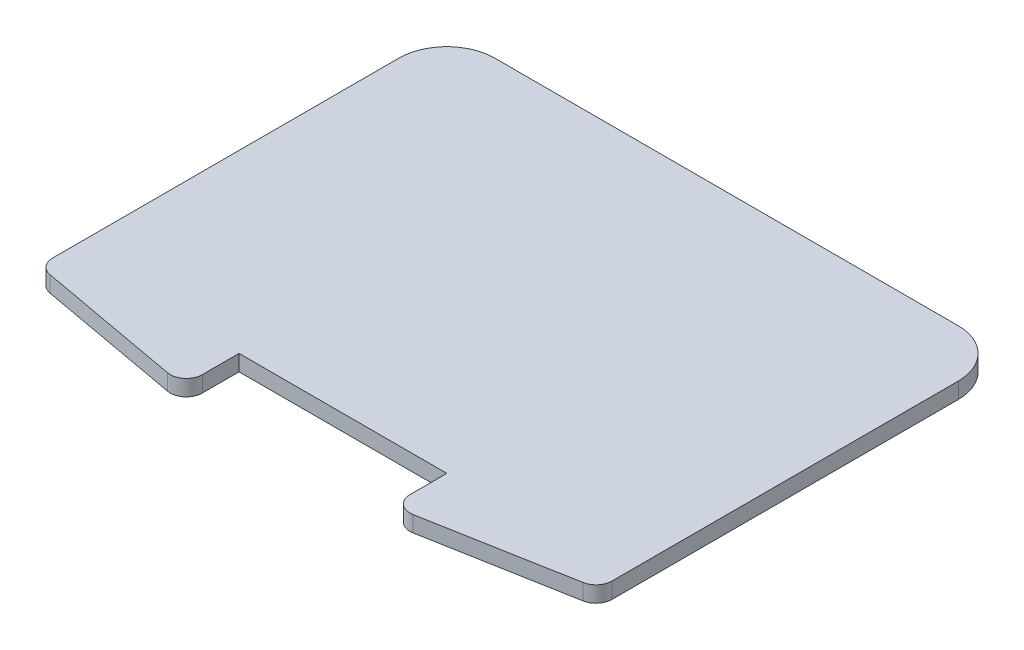
ISO-10303-21;
HEADER;
FILE_DESCRIPTION(('STEP AP214'),'2;1');
FILE_NAME('part.step','',(''),(''),'','','');
FILE_SCHEMA(('AUTOMOTIVE_DESIGN { 1 0 10303 214 1 1 1 1 }'));
ENDSEC;
DATA;
#1=APPLICATION_CONTEXT('core data for automotive mechanical design processes');
#2=APPLICATION_PROTOCOL_DEFINITION('international standard','automotive_design',2000,#1);
#3=PRODUCT_CONTEXT('',#1,'mechanical');
#4=PRODUCT('Part','Part','',(#3));
#5=PRODUCT_RELATED_PRODUCT_CATEGORY('part','',(#4));
#6=PRODUCT_DEFINITION_FORMATION('','',#4);
#7=PRODUCT_DEFINITION_CONTEXT('part definition',#1,'design');
#8=PRODUCT_DEFINITION('design','',#6,#7);
#9=PRODUCT_DEFINITION_SHAPE('','',#8);
#10=(LENGTH_UNIT() NAMED_UNIT(*) SI_UNIT(.MILLI.,.METRE.));
#11=(NAMED_UNIT(*) PLANE_ANGLE_UNIT() SI_UNIT($,.RADIAN.));
#12=(NAMED_UNIT(*) SI_UNIT($,.STERADIAN.) SOLID_ANGLE_UNIT());
#13=UNCERTAINTY_MEASURE_WITH_UNIT(LENGTH_MEASURE(1.E-05),#10,'distance_accuracy_value','');
#14=(GEOMETRIC_REPRESENTATION_CONTEXT(3) GLOBAL_UNCERTAINTY_ASSIGNED_CONTEXT((#13)) GLOBAL_UNIT_ASSIGNED_CONTEXT((#10,
#11,#12)) REPRESENTATION_CONTEXT('',''));
#15=CARTESIAN_POINT('',(0.,0.,0.));
#16=DIRECTION('',(0.,0.,1.));
#17=DIRECTION('',(1.,0.,0.));
#18=AXIS2_PLACEMENT_3D('',#15,#16,#17);
#19=CARTESIAN_POINT('',(17.5,1.,-12.75));
#20=DIRECTION('',(-1.,0.,0.));
#21=DIRECTION('',(0.,0.,1.));
#22=AXIS2_PLACEMENT_3D('',#19,#20,#21);
#23=PLANE('',#22);
#24=DIRECTION('',(0.,0.,-1.));
#25=VECTOR('',#24,1.);
#26=CARTESIAN_POINT('',(17.5,1.,-12.75));
#27=LINE('',#26,#25);
#28=CARTESIAN_POINT('',(17.5,1.,11.915423646591));
#29=VERTEX_POINT('',#28);
#30=CARTESIAN_POINT('',(17.5,1.,-9.75));
#31=VERTEX_POINT('',#30);
#32=EDGE_CURVE('E186',#29,#31,#27,.T.);
#33=ORIENTED_EDGE('',*,*,#32,.F.);
#34=DIRECTION('',(0.,-1.,0.));
#35=VECTOR('',#34,1.);
#36=CARTESIAN_POINT('',(17.5,0.,11.915423646591));
#37=LINE('',#36,#35);
#38=CARTESIAN_POINT('',(17.5,0.,11.915423646591));
#39=VERTEX_POINT('',#38);
#40=EDGE_CURVE('E221',#29,#39,#37,.T.);
#41=ORIENTED_EDGE('',*,*,#40,.T.);
#42=DIRECTION('',(0.,0.,-1.));
#43=VECTOR('',#42,1.);
#44=CARTESIAN_POINT('',(17.5,0.,-12.75));
#45=LINE('',#44,#43);
#46=CARTESIAN_POINT('',(17.5,0.,-9.75));
#47=VERTEX_POINT('',#46);
#48=EDGE_CURVE('E183',#39,#47,#45,.T.);
#49=ORIENTED_EDGE('',*,*,#48,.T.);
#50=DIRECTION('',(0.,-1.,0.));
#51=VECTOR('',#50,1.);
#52=CARTESIAN_POINT('',(17.5,1.,-9.75));
#53=LINE('',#52,#51);
#54=EDGE_CURVE('E211',#47,#31,#53,.F.);
#55=ORIENTED_EDGE('',*,*,#54,.T.);
#56=EDGE_LOOP('',(#33,#41,#49,#55));
#57=FACE_BOUND('',#56,.T.);
#58=ADVANCED_FACE('F38',(#57),#23,.F.);
#59=CARTESIAN_POINT('',(-17.5,1.,-12.75));
#60=DIRECTION('',(0.,0.,1.));
#61=DIRECTION('',(1.,0.,0.));
#62=AXIS2_PLACEMENT_3D('',#59,#60,#61);
#63=PLANE('',#62);
#64=DIRECTION('',(-1.,0.,0.));
#65=VECTOR('',#64,1.);
#66=CARTESIAN_POINT('',(-17.5,1.,-12.75));
#67=LINE('',#66,#65);
#68=CARTESIAN_POINT('',(14.5,1.,-12.75));
#69=VERTEX_POINT('',#68);
#70=CARTESIAN_POINT('',(-14.5,1.,-12.75));
#71=VERTEX_POINT('',#70);
#72=EDGE_CURVE('E188',#69,#71,#67,.T.);
#73=ORIENTED_EDGE('',*,*,#72,.F.);
#74=DIRECTION('',(0.,-1.,0.));
#75=VECTOR('',#74,1.);
#76=CARTESIAN_POINT('',(14.5,1.,-12.75));
#77=LINE('',#76,#75);
#78=CARTESIAN_POINT('',(14.5,0.,-12.75));
#79=VERTEX_POINT('',#78);
#80=EDGE_CURVE('E203',#69,#79,#77,.T.);
#81=ORIENTED_EDGE('',*,*,#80,.T.);
#82=DIRECTION('',(-1.,0.,0.));
#83=VECTOR('',#82,1.);
#84=CARTESIAN_POINT('',(-17.5,0.,-12.75));
#85=LINE('',#84,#83);
#86=CARTESIAN_POINT('',(-14.5,0.,-12.75));
#87=VERTEX_POINT('',#86);
#88=EDGE_CURVE('E197',#79,#87,#85,.T.);
#89=ORIENTED_EDGE('',*,*,#88,.T.);
#90=DIRECTION('',(0.,-1.,0.));
#91=VECTOR('',#90,1.);
#92=CARTESIAN_POINT('',(-14.5,1.,-12.75));
#93=LINE('',#92,#91);
#94=EDGE_CURVE('E195',#87,#71,#93,.F.);
#95=ORIENTED_EDGE('',*,*,#94,.T.);
#96=EDGE_LOOP('',(#73,#81,#89,#95));
#97=FACE_BOUND('',#96,.T.);
#98=ADVANCED_FACE('F276',(#97),#63,.F.);
#99=CARTESIAN_POINT('',(-17.5,1.,-12.75));
#100=DIRECTION('',(1.,0.,0.));
#101=DIRECTION('',(0.,0.,-1.));
#102=AXIS2_PLACEMENT_3D('',#99,#100,#101);
#103=PLANE('',#102);
#104=DIRECTION('',(0.,0.,1.));
#105=VECTOR('',#104,1.);
#106=CARTESIAN_POINT('',(-17.5,0.,-12.75));
#107=LINE('',#106,#105);
#108=CARTESIAN_POINT('',(-17.5,0.,-9.75));
#109=VERTEX_POINT('',#108);
#110=CARTESIAN_POINT('',(-17.5,0.,11.915423646591));
#111=VERTEX_POINT('',#110);
#112=EDGE_CURVE('E189',#109,#111,#107,.T.);
#113=ORIENTED_EDGE('',*,*,#112,.T.);
#114=DIRECTION('',(0.,-1.,0.));
#115=VECTOR('',#114,1.);
#116=CARTESIAN_POINT('',(-17.5,1.,11.915423646591));
#117=LINE('',#116,#115);
#118=CARTESIAN_POINT('',(-17.5,1.,11.915423646591));
#119=VERTEX_POINT('',#118);
#120=EDGE_CURVE('E11',#111,#119,#117,.F.);
#121=ORIENTED_EDGE('',*,*,#120,.T.);
#122=DIRECTION('',(0.,0.,1.));
#123=VECTOR('',#122,1.);
#124=CARTESIAN_POINT('',(-17.5,1.,-12.75));
#125=LINE('',#124,#123);
#126=CARTESIAN_POINT('',(-17.5,1.,-9.75));
#127=VERTEX_POINT('',#126);
#128=EDGE_CURVE('E192',#127,#119,#125,.T.);
#129=ORIENTED_EDGE('',*,*,#128,.F.);
#130=DIRECTION('',(0.,-1.,0.));
#131=VECTOR('',#130,1.);
#132=CARTESIAN_POINT('',(-17.5,1.,-9.75));
#133=LINE('',#132,#131);
#134=EDGE_CURVE('E218',#127,#109,#133,.T.);
#135=ORIENTED_EDGE('',*,*,#134,.T.);
#136=EDGE_LOOP('',(#113,#121,#129,#135));
#137=FACE_BOUND('',#136,.T.);
#138=ADVANCED_FACE('F267',(#137),#103,.F.);
#139=CARTESIAN_POINT('',(0.,1.,0.));
#140=DIRECTION('',(0.,1.,0.));
#141=DIRECTION('',(0.,0.,1.));
#142=AXIS2_PLACEMENT_3D('',#139,#140,#141);
#143=PLANE('',#142);
#144=DIRECTION('',(0.983869910099907,0.,-0.178885438199984));
#145=VECTOR('',#144,1.);
#146=CARTESIAN_POINT('',(17.5,1.,12.75));
#147=LINE('',#146,#145);
#148=CARTESIAN_POINT('',(7.6788854382,1.,14.5356571930545));
#149=VERTEX_POINT('',#148);
#150=CARTESIAN_POINT('',(16.6788854382,1.,12.8992935566909));
#151=VERTEX_POINT('',#150);
#152=EDGE_CURVE('E170',#149,#151,#147,.T.);
#153=ORIENTED_EDGE('',*,*,#152,.T.);
#154=CARTESIAN_POINT('',(16.5,1.,11.915423646591));
#155=DIRECTION('',(0.,1.,0.));
#156=DIRECTION('',(0.,0.,1.));
#157=AXIS2_PLACEMENT_3D('',#154,#155,#156);
#158=CIRCLE('',#157,1.);
#159=EDGE_CURVE('E239',#151,#29,#158,.T.);
#160=ORIENTED_EDGE('',*,*,#159,.T.);
#161=ORIENTED_EDGE('',*,*,#32,.T.);
#162=CARTESIAN_POINT('',(14.5,1.,-9.75));
#163=DIRECTION('',(0.,1.,0.));
#164=DIRECTION('',(0.,0.,1.));
#165=AXIS2_PLACEMENT_3D('',#162,#163,#164);
#166=CIRCLE('',#165,3.);
#167=EDGE_CURVE('E216',#31,#69,#166,.T.);
#168=ORIENTED_EDGE('',*,*,#167,.T.);
#169=ORIENTED_EDGE('',*,*,#72,.T.);
#170=CARTESIAN_POINT('',(-14.5,1.,-9.75));
#171=DIRECTION('',(0.,1.,0.));
#172=DIRECTION('',(0.,0.,1.));
#173=AXIS2_PLACEMENT_3D('',#170,#171,#172);
#174=CIRCLE('',#173,3.);
#175=EDGE_CURVE('E214',#71,#127,#174,.T.);
#176=ORIENTED_EDGE('',*,*,#175,.T.);
#177=ORIENTED_EDGE('',*,*,#128,.T.);
#178=CARTESIAN_POINT('',(-16.5,1.,11.915423646591));
#179=DIRECTION('',(0.,1.,0.));
#180=DIRECTION('',(0.,0.,1.));
#181=AXIS2_PLACEMENT_3D('',#178,#179,#180);
#182=CIRCLE('',#181,1.);
#183=CARTESIAN_POINT('',(-16.6788854382,1.,12.8992935566909));
#184=VERTEX_POINT('',#183);
#185=EDGE_CURVE('E235',#119,#184,#182,.T.);
#186=ORIENTED_EDGE('',*,*,#185,.T.);
#187=DIRECTION('',(0.983869910099907,0.,0.178885438199983));
#188=VECTOR('',#187,1.);
#189=CARTESIAN_POINT('',(-17.5,1.,12.75));
#190=LINE('',#189,#188);
#191=CARTESIAN_POINT('',(-7.67888543819998,1.,14.5356571930545));
#192=VERTEX_POINT('',#191);
#193=EDGE_CURVE('E150',#184,#192,#190,.T.);
#194=ORIENTED_EDGE('',*,*,#193,.T.);
#195=CARTESIAN_POINT('',(-7.5,1.,13.5517872829546));
#196=DIRECTION('',(0.,1.,0.));
#197=DIRECTION('',(0.,0.,1.));
#198=AXIS2_PLACEMENT_3D('',#195,#196,#197);
#199=CIRCLE('',#198,1.);
#200=CARTESIAN_POINT('',(-6.5,1.,13.5517872829546));
#201=VERTEX_POINT('',#200);
#202=EDGE_CURVE('E61',#192,#201,#199,.T.);
#203=ORIENTED_EDGE('',*,*,#202,.T.);
#204=DIRECTION('',(0.,0.,-1.));
#205=VECTOR('',#204,1.);
#206=CARTESIAN_POINT('',(-6.5,1.,14.75));
#207=LINE('',#206,#205);
#208=CARTESIAN_POINT('',(-6.5,1.,11.25));
#209=VERTEX_POINT('',#208);
#210=EDGE_CURVE('E181',#201,#209,#207,.T.);
#211=ORIENTED_EDGE('',*,*,#210,.T.);
#212=DIRECTION('',(-1.,0.,0.));
#213=VECTOR('',#212,1.);
#214=CARTESIAN_POINT('',(-6.5,1.,11.25));
#215=LINE('',#214,#213);
#216=CARTESIAN_POINT('',(6.50000000000001,1.,11.25));
#217=VERTEX_POINT('',#216);
#218=EDGE_CURVE('E166',#217,#209,#215,.T.);
#219=ORIENTED_EDGE('',*,*,#218,.F.);
#220=DIRECTION('',(0.,0.,1.));
#221=VECTOR('',#220,1.);
#222=CARTESIAN_POINT('',(6.50000000000002,1.,14.75));
#223=LINE('',#222,#221);
#224=CARTESIAN_POINT('',(6.50000000000001,1.,13.5517872829546));
#225=VERTEX_POINT('',#224);
#226=EDGE_CURVE('E157',#217,#225,#223,.T.);
#227=ORIENTED_EDGE('',*,*,#226,.T.);
#228=CARTESIAN_POINT('',(7.50000000000001,1.,13.5517872829546));
#229=DIRECTION('',(0.,1.,0.));
#230=DIRECTION('',(0.,0.,1.));
#231=AXIS2_PLACEMENT_3D('',#228,#229,#230);
#232=CIRCLE('',#231,1.);
#233=EDGE_CURVE('E53',#225,#149,#232,.T.);
#234=ORIENTED_EDGE('',*,*,#233,.T.);
#235=EDGE_LOOP('',(#153,#160,#161,#168,#169,#176,#177,#186,#194,#203,#211,#219,#227,#234));
#236=FACE_BOUND('',#235,.T.);
#237=ADVANCED_FACE('F260',(#236),#143,.T.);
#238=CARTESIAN_POINT('',(0.,0.,0.));
#239=DIRECTION('',(0.,1.,0.));
#240=DIRECTION('',(0.,0.,1.));
#241=AXIS2_PLACEMENT_3D('',#238,#239,#240);
#242=PLANE('',#241);
#243=ORIENTED_EDGE('',*,*,#48,.F.);
#244=CARTESIAN_POINT('',(16.5,0.,11.915423646591));
#245=DIRECTION('',(0.,1.,0.));
#246=DIRECTION('',(0.,0.,1.));
#247=AXIS2_PLACEMENT_3D('',#244,#245,#246);
#248=CIRCLE('',#247,1.);
#249=CARTESIAN_POINT('',(16.6788854382,0.,12.8992935566909));
#250=VERTEX_POINT('',#249);
#251=EDGE_CURVE('E229',#39,#250,#248,.F.);
#252=ORIENTED_EDGE('',*,*,#251,.T.);
#253=DIRECTION('',(0.983869910099907,0.,-0.178885438199984));
#254=VECTOR('',#253,1.);
#255=CARTESIAN_POINT('',(17.5,0.,12.75));
#256=LINE('',#255,#254);
#257=CARTESIAN_POINT('',(7.6788854382,0.,14.5356571930545));
#258=VERTEX_POINT('',#257);
#259=EDGE_CURVE('E151',#258,#250,#256,.T.);
#260=ORIENTED_EDGE('',*,*,#259,.F.);
#261=CARTESIAN_POINT('',(7.50000000000001,0.,13.5517872829546));
#262=DIRECTION('',(0.,1.,0.));
#263=DIRECTION('',(0.,0.,1.));
#264=AXIS2_PLACEMENT_3D('',#261,#262,#263);
#265=CIRCLE('',#264,1.);
#266=CARTESIAN_POINT('',(6.50000000000001,0.,13.5517872829546));
#267=VERTEX_POINT('',#266);
#268=EDGE_CURVE('E148',#258,#267,#265,.F.);
#269=ORIENTED_EDGE('',*,*,#268,.T.);
#270=DIRECTION('',(0.,0.,1.));
#271=VECTOR('',#270,1.);
#272=CARTESIAN_POINT('',(6.50000000000002,0.,14.75));
#273=LINE('',#272,#271);
#274=CARTESIAN_POINT('',(6.50000000000001,0.,11.25));
#275=VERTEX_POINT('',#274);
#276=EDGE_CURVE('E139',#275,#267,#273,.T.);
#277=ORIENTED_EDGE('',*,*,#276,.F.);
#278=DIRECTION('',(-1.,0.,0.));
#279=VECTOR('',#278,1.);
#280=CARTESIAN_POINT('',(-6.5,0.,11.25));
#281=LINE('',#280,#279);
#282=CARTESIAN_POINT('',(-6.5,0.,11.25));
#283=VERTEX_POINT('',#282);
#284=EDGE_CURVE('E145',#275,#283,#281,.T.);
#285=ORIENTED_EDGE('',*,*,#284,.T.);
#286=DIRECTION('',(0.,0.,-1.));
#287=VECTOR('',#286,1.);
#288=CARTESIAN_POINT('',(-6.5,0.,14.75));
#289=LINE('',#288,#287);
#290=CARTESIAN_POINT('',(-6.5,0.,13.5517872829546));
#291=VERTEX_POINT('',#290);
#292=EDGE_CURVE('E180',#291,#283,#289,.T.);
#293=ORIENTED_EDGE('',*,*,#292,.F.);
#294=CARTESIAN_POINT('',(-7.5,0.,13.5517872829546));
#295=DIRECTION('',(0.,1.,0.));
#296=DIRECTION('',(0.,0.,1.));
#297=AXIS2_PLACEMENT_3D('',#294,#295,#296);
#298=CIRCLE('',#297,1.);
#299=CARTESIAN_POINT('',(-7.67888543819998,0.,14.5356571930545));
#300=VERTEX_POINT('',#299);
#301=EDGE_CURVE('E226',#291,#300,#298,.F.);
#302=ORIENTED_EDGE('',*,*,#301,.T.);
#303=DIRECTION('',(0.983869910099907,0.,0.178885438199983));
#304=VECTOR('',#303,1.);
#305=CARTESIAN_POINT('',(-17.5,0.,12.75));
#306=LINE('',#305,#304);
#307=CARTESIAN_POINT('',(-16.6788854382,0.,12.8992935566909));
#308=VERTEX_POINT('',#307);
#309=EDGE_CURVE('E177',#308,#300,#306,.T.);
#310=ORIENTED_EDGE('',*,*,#309,.F.);
#311=CARTESIAN_POINT('',(-16.5,0.,11.915423646591));
#312=DIRECTION('',(0.,1.,0.));
#313=DIRECTION('',(0.,0.,1.));
#314=AXIS2_PLACEMENT_3D('',#311,#312,#313);
#315=CIRCLE('',#314,1.);
#316=EDGE_CURVE('E224',#308,#111,#315,.F.);
#317=ORIENTED_EDGE('',*,*,#316,.T.);
#318=ORIENTED_EDGE('',*,*,#112,.F.);
#319=CARTESIAN_POINT('',(-14.5,0.,-9.75));
#320=DIRECTION('',(0.,1.,0.));
#321=DIRECTION('',(0.,0.,1.));
#322=AXIS2_PLACEMENT_3D('',#319,#320,#321);
#323=CIRCLE('',#322,3.);
#324=EDGE_CURVE('E206',#109,#87,#323,.F.);
#325=ORIENTED_EDGE('',*,*,#324,.T.);
#326=ORIENTED_EDGE('',*,*,#88,.F.);
#327=CARTESIAN_POINT('',(14.5,0.,-9.75));
#328=DIRECTION('',(0.,1.,0.));
#329=DIRECTION('',(0.,0.,1.));
#330=AXIS2_PLACEMENT_3D('',#327,#328,#329);
#331=CIRCLE('',#330,3.);
#332=EDGE_CURVE('E208',#79,#47,#331,.F.);
#333=ORIENTED_EDGE('',*,*,#332,.T.);
#334=EDGE_LOOP('',(#243,#252,#260,#269,#277,#285,#293,#302,#310,#317,#318,#325,#326,#333));
#335=FACE_BOUND('',#334,.T.);
#336=ADVANCED_FACE('F142',(#335),#242,.F.);
#337=CARTESIAN_POINT('',(-6.5,0.,14.75));
#338=DIRECTION('',(1.,0.,0.));
#339=DIRECTION('',(0.,0.,-1.));
#340=AXIS2_PLACEMENT_3D('',#337,#338,#339);
#341=PLANE('',#340);
#342=ORIENTED_EDGE('',*,*,#210,.F.);
#343=DIRECTION('',(0.,1.,0.));
#344=VECTOR('',#343,1.);
#345=CARTESIAN_POINT('',(-6.5,0.,13.5517872829546));
#346=LINE('',#345,#344);
#347=EDGE_CURVE('E46',#201,#291,#346,.F.);
#348=ORIENTED_EDGE('',*,*,#347,.T.);
#349=ORIENTED_EDGE('',*,*,#292,.T.);
#350=DIRECTION('',(0.,1.,0.));
#351=VECTOR('',#350,1.);
#352=CARTESIAN_POINT('',(-6.5,0.,11.25));
#353=LINE('',#352,#351);
#354=EDGE_CURVE('E161',#283,#209,#353,.T.);
#355=ORIENTED_EDGE('',*,*,#354,.T.);
#356=EDGE_LOOP('',(#342,#348,#349,#355));
#357=FACE_BOUND('',#356,.T.);
#358=ADVANCED_FACE('F250',(#357),#341,.T.);
#359=CARTESIAN_POINT('',(-17.5,0.,12.75));
#360=DIRECTION('',(-0.178885438199983,0.,0.983869910099907));
#361=DIRECTION('',(0.983869910099907,0.,0.178885438199983));
#362=AXIS2_PLACEMENT_3D('',#359,#360,#361);
#363=PLANE('',#362);
#364=ORIENTED_EDGE('',*,*,#309,.T.);
#365=DIRECTION('',(0.,1.,0.));
#366=VECTOR('',#365,1.);
#367=CARTESIAN_POINT('',(-7.67888543819998,0.,14.5356571930545));
#368=LINE('',#367,#366);
#369=EDGE_CURVE('E246',#300,#192,#368,.T.);
#370=ORIENTED_EDGE('',*,*,#369,.T.);
#371=ORIENTED_EDGE('',*,*,#193,.F.);
#372=DIRECTION('',(0.,-1.,0.));
#373=VECTOR('',#372,1.);
#374=CARTESIAN_POINT('',(-16.6788854382,0.,12.8992935566909));
#375=LINE('',#374,#373);
#376=EDGE_CURVE('E243',#184,#308,#375,.T.);
#377=ORIENTED_EDGE('',*,*,#376,.T.);
#378=EDGE_LOOP('',(#364,#370,#371,#377));
#379=FACE_BOUND('',#378,.T.);
#380=ADVANCED_FACE('F258',(#379),#363,.T.);
#381=CARTESIAN_POINT('',(17.5,0.,12.75));
#382=DIRECTION('',(0.178885438199984,0.,0.983869910099907));
#383=DIRECTION('',(0.983869910099907,0.,-0.178885438199984));
#384=AXIS2_PLACEMENT_3D('',#381,#382,#383);
#385=PLANE('',#384);
#386=ORIENTED_EDGE('',*,*,#259,.T.);
#387=DIRECTION('',(0.,-1.,0.));
#388=VECTOR('',#387,1.);
#389=CARTESIAN_POINT('',(16.6788854382,1.,12.8992935566909));
#390=LINE('',#389,#388);
#391=EDGE_CURVE('E233',#250,#151,#390,.F.);
#392=ORIENTED_EDGE('',*,*,#391,.T.);
#393=ORIENTED_EDGE('',*,*,#152,.F.);
#394=DIRECTION('',(0.,1.,0.));
#395=VECTOR('',#394,1.);
#396=CARTESIAN_POINT('',(7.6788854382,0.,14.5356571930545));
#397=LINE('',#396,#395);
#398=EDGE_CURVE('E231',#149,#258,#397,.F.);
#399=ORIENTED_EDGE('',*,*,#398,.T.);
#400=EDGE_LOOP('',(#386,#392,#393,#399));
#401=FACE_BOUND('',#400,.T.);
#402=ADVANCED_FACE('F291',(#401),#385,.T.);
#403=CARTESIAN_POINT('',(6.50000000000002,0.,14.75));
#404=DIRECTION('',(-1.,0.,0.));
#405=DIRECTION('',(0.,0.,1.));
#406=AXIS2_PLACEMENT_3D('',#403,#404,#405);
#407=PLANE('',#406);
#408=ORIENTED_EDGE('',*,*,#276,.T.);
#409=DIRECTION('',(0.,1.,0.));
#410=VECTOR('',#409,1.);
#411=CARTESIAN_POINT('',(6.50000000000001,0.,13.5517872829546));
#412=LINE('',#411,#410);
#413=EDGE_CURVE('E241',#267,#225,#412,.T.);
#414=ORIENTED_EDGE('',*,*,#413,.T.);
#415=ORIENTED_EDGE('',*,*,#226,.F.);
#416=DIRECTION('',(0.,1.,0.));
#417=VECTOR('',#416,1.);
#418=CARTESIAN_POINT('',(6.50000000000001,0.,11.25));
#419=LINE('',#418,#417);
#420=EDGE_CURVE('E154',#275,#217,#419,.T.);
#421=ORIENTED_EDGE('',*,*,#420,.F.);
#422=EDGE_LOOP('',(#408,#414,#415,#421));
#423=FACE_BOUND('',#422,.T.);
#424=ADVANCED_FACE('F155',(#423),#407,.T.);
#425=CARTESIAN_POINT('',(-6.5,0.,11.25));
#426=DIRECTION('',(0.,0.,-1.));
#427=DIRECTION('',(-1.,0.,0.));
#428=AXIS2_PLACEMENT_3D('',#425,#426,#427);
#429=PLANE('',#428);
#430=ORIENTED_EDGE('',*,*,#218,.T.);
#431=ORIENTED_EDGE('',*,*,#354,.F.);
#432=ORIENTED_EDGE('',*,*,#284,.F.);
#433=ORIENTED_EDGE('',*,*,#420,.T.);
#434=EDGE_LOOP('',(#430,#431,#432,#433));
#435=FACE_BOUND('',#434,.T.);
#436=ADVANCED_FACE('F164',(#435),#429,.F.);
#437=CARTESIAN_POINT('',(14.5,1.,-9.75));
#438=DIRECTION('',(0.,-1.,0.));
#439=DIRECTION('',(0.,0.,-1.));
#440=AXIS2_PLACEMENT_3D('',#437,#438,#439);
#441=CYLINDRICAL_SURFACE('',#440,3.);
#442=ORIENTED_EDGE('',*,*,#167,.F.);
#443=ORIENTED_EDGE('',*,*,#54,.F.);
#444=ORIENTED_EDGE('',*,*,#332,.F.);
#445=ORIENTED_EDGE('',*,*,#80,.F.);
#446=EDGE_LOOP('',(#442,#443,#444,#445));
#447=FACE_BOUND('',#446,.T.);
#448=ADVANCED_FACE('F280',(#447),#441,.T.);
#449=CARTESIAN_POINT('',(-14.5,1.,-9.75));
#450=DIRECTION('',(0.,-1.,0.));
#451=DIRECTION('',(0.,0.,-1.));
#452=AXIS2_PLACEMENT_3D('',#449,#450,#451);
#453=CYLINDRICAL_SURFACE('',#452,3.);
#454=ORIENTED_EDGE('',*,*,#175,.F.);
#455=ORIENTED_EDGE('',*,*,#94,.F.);
#456=ORIENTED_EDGE('',*,*,#324,.F.);
#457=ORIENTED_EDGE('',*,*,#134,.F.);
#458=EDGE_LOOP('',(#454,#455,#456,#457));
#459=FACE_BOUND('',#458,.T.);
#460=ADVANCED_FACE('F271',(#459),#453,.T.);
#461=CARTESIAN_POINT('',(16.5,1.,11.915423646591));
#462=DIRECTION('',(0.,1.,0.));
#463=DIRECTION('',(0.,0.,1.));
#464=AXIS2_PLACEMENT_3D('',#461,#462,#463);
#465=CYLINDRICAL_SURFACE('',#464,1.);
#466=ORIENTED_EDGE('',*,*,#159,.F.);
#467=ORIENTED_EDGE('',*,*,#391,.F.);
#468=ORIENTED_EDGE('',*,*,#251,.F.);
#469=ORIENTED_EDGE('',*,*,#40,.F.);
#470=EDGE_LOOP('',(#466,#467,#468,#469));
#471=FACE_BOUND('',#470,.T.);
#472=ADVANCED_FACE('F287',(#471),#465,.T.);
#473=CARTESIAN_POINT('',(7.50000000000001,0.,13.5517872829546));
#474=DIRECTION('',(0.,1.,0.));
#475=DIRECTION('',(0.,0.,1.));
#476=AXIS2_PLACEMENT_3D('',#473,#474,#475);
#477=CYLINDRICAL_SURFACE('',#476,1.);
#478=ORIENTED_EDGE('',*,*,#268,.F.);
#479=ORIENTED_EDGE('',*,*,#398,.F.);
#480=ORIENTED_EDGE('',*,*,#233,.F.);
#481=ORIENTED_EDGE('',*,*,#413,.F.);
#482=EDGE_LOOP('',(#478,#479,#480,#481));
#483=FACE_BOUND('',#482,.T.);
#484=ADVANCED_FACE('F292',(#483),#477,.T.);
#485=CARTESIAN_POINT('',(-7.5,0.,13.5517872829546));
#486=DIRECTION('',(0.,1.,0.));
#487=DIRECTION('',(0.,0.,1.));
#488=AXIS2_PLACEMENT_3D('',#485,#486,#487);
#489=CYLINDRICAL_SURFACE('',#488,1.);
#490=ORIENTED_EDGE('',*,*,#301,.F.);
#491=ORIENTED_EDGE('',*,*,#347,.F.);
#492=ORIENTED_EDGE('',*,*,#202,.F.);
#493=ORIENTED_EDGE('',*,*,#369,.F.);
#494=EDGE_LOOP('',(#490,#491,#492,#493));
#495=FACE_BOUND('',#494,.T.);
#496=ADVANCED_FACE('F255',(#495),#489,.T.);
#497=CARTESIAN_POINT('',(-16.5,0.,11.915423646591));
#498=DIRECTION('',(0.,1.,0.));
#499=DIRECTION('',(0.,0.,1.));
#500=AXIS2_PLACEMENT_3D('',#497,#498,#499);
#501=CYLINDRICAL_SURFACE('',#500,1.);
#502=ORIENTED_EDGE('',*,*,#185,.F.);
#503=ORIENTED_EDGE('',*,*,#120,.F.);
#504=ORIENTED_EDGE('',*,*,#316,.F.);
#505=ORIENTED_EDGE('',*,*,#376,.F.);
#506=EDGE_LOOP('',(#502,#503,#504,#505));
#507=FACE_BOUND('',#506,.T.);
#508=ADVANCED_FACE('F40',(#507),#501,.T.);
#509=CLOSED_SHELL('',(#58,#98,#138,#237,#336,#358,#380,#402,#424,#436,#448,#460,#472,#484,#496,#508));
#510=MANIFOLD_SOLID_BREP('B2',#509);
#511=ADVANCED_BREP_SHAPE_REPRESENTATION('',(#18,#510),#14);
#512=SHAPE_DEFINITION_REPRESENTATION(#9,#511);
ENDSEC;
END-ISO-10303-21;
